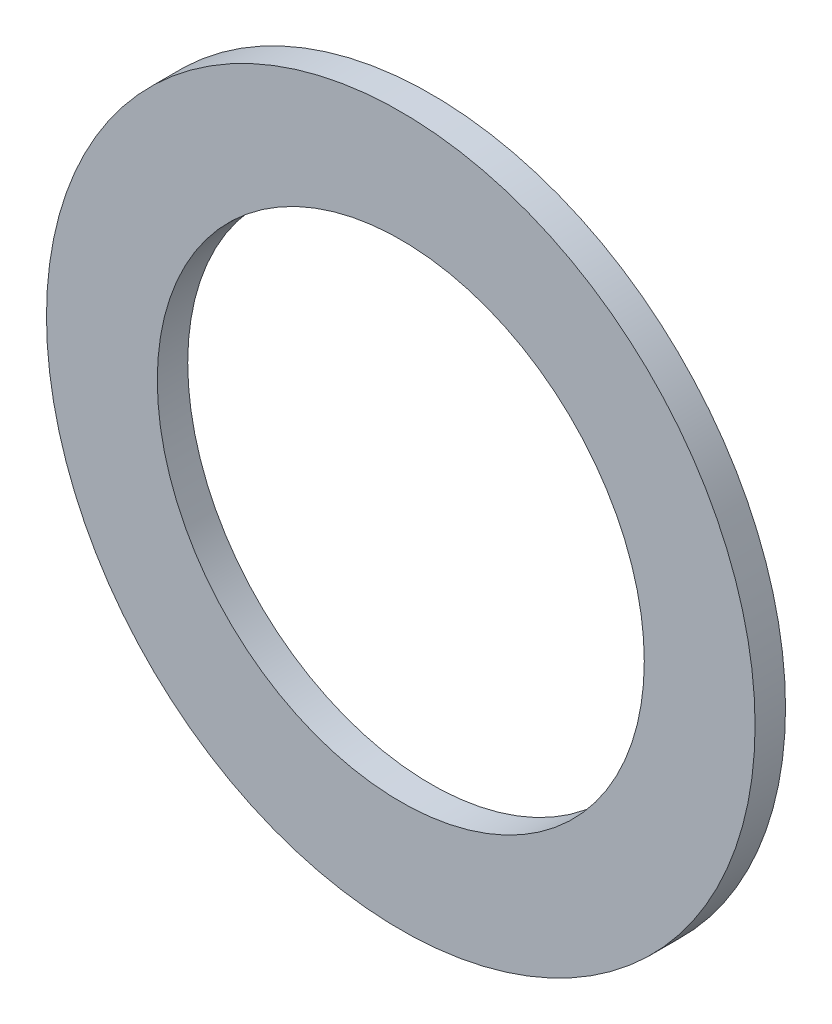
ISO-10303-21;
HEADER;
FILE_DESCRIPTION(('STEP AP214'),'2;1');
FILE_NAME('part.step','',(''),(''),'','','');
FILE_SCHEMA(('AUTOMOTIVE_DESIGN { 1 0 10303 214 1 1 1 1 }'));
ENDSEC;
DATA;
#1=APPLICATION_CONTEXT('core data for automotive mechanical design processes');
#2=APPLICATION_PROTOCOL_DEFINITION('international standard','automotive_design',2000,#1);
#3=PRODUCT_CONTEXT('',#1,'mechanical');
#4=PRODUCT('Part','Part','',(#3));
#5=PRODUCT_RELATED_PRODUCT_CATEGORY('part','',(#4));
#6=PRODUCT_DEFINITION_FORMATION('','',#4);
#7=PRODUCT_DEFINITION_CONTEXT('part definition',#1,'design');
#8=PRODUCT_DEFINITION('design','',#6,#7);
#9=PRODUCT_DEFINITION_SHAPE('','',#8);
#10=(LENGTH_UNIT() NAMED_UNIT(*) SI_UNIT(.MILLI.,.METRE.));
#11=(NAMED_UNIT(*) PLANE_ANGLE_UNIT() SI_UNIT($,.RADIAN.));
#12=(NAMED_UNIT(*) SI_UNIT($,.STERADIAN.) SOLID_ANGLE_UNIT());
#13=UNCERTAINTY_MEASURE_WITH_UNIT(LENGTH_MEASURE(1.E-05),#10,'distance_accuracy_value','');
#14=(GEOMETRIC_REPRESENTATION_CONTEXT(3) GLOBAL_UNCERTAINTY_ASSIGNED_CONTEXT((#13)) GLOBAL_UNIT_ASSIGNED_CONTEXT((#10,
#11,#12)) REPRESENTATION_CONTEXT('',''));
#15=CARTESIAN_POINT('',(0.,0.,0.));
#16=DIRECTION('',(0.,0.,1.));
#17=DIRECTION('',(1.,0.,0.));
#18=AXIS2_PLACEMENT_3D('',#15,#16,#17);
#19=CARTESIAN_POINT('',(0.,0.,6.35));
#20=DIRECTION('',(0.,0.,1.));
#21=DIRECTION('',(1.,0.,0.));
#22=AXIS2_PLACEMENT_3D('',#19,#20,#21);
#23=PLANE('',#22);
#24=CARTESIAN_POINT('',(0.,0.,6.35));
#25=DIRECTION('',(0.,0.,1.));
#26=DIRECTION('',(1.,0.,0.));
#27=AXIS2_PLACEMENT_3D('',#24,#25,#26);
#28=CIRCLE('',#27,73.914);
#29=CARTESIAN_POINT('',(73.914,0.,6.35));
#30=VERTEX_POINT('',#29);
#31=EDGE_CURVE('E10',#30,#30,#28,.T.);
#32=ORIENTED_EDGE('',*,*,#31,.T.);
#33=EDGE_LOOP('',(#32));
#34=FACE_BOUND('',#33,.T.);
#35=CARTESIAN_POINT('',(0.,0.,6.35));
#36=DIRECTION('',(0.,0.,1.));
#37=DIRECTION('',(1.,0.,0.));
#38=AXIS2_PLACEMENT_3D('',#35,#36,#37);
#39=CIRCLE('',#38,50.8);
#40=CARTESIAN_POINT('',(50.8,0.,6.35));
#41=VERTEX_POINT('',#40);
#42=EDGE_CURVE('E45',#41,#41,#39,.T.);
#43=ORIENTED_EDGE('',*,*,#42,.F.);
#44=EDGE_LOOP('',(#43));
#45=FACE_BOUND('',#44,.T.);
#46=ADVANCED_FACE('F34',(#34,#45),#23,.T.);
#47=CARTESIAN_POINT('',(0.,0.,0.));
#48=DIRECTION('',(0.,0.,1.));
#49=DIRECTION('',(1.,0.,0.));
#50=AXIS2_PLACEMENT_3D('',#47,#48,#49);
#51=PLANE('',#50);
#52=CARTESIAN_POINT('',(0.,0.,0.));
#53=DIRECTION('',(0.,0.,1.));
#54=DIRECTION('',(1.,0.,0.));
#55=AXIS2_PLACEMENT_3D('',#52,#53,#54);
#56=CIRCLE('',#55,73.914);
#57=CARTESIAN_POINT('',(73.914,0.,0.));
#58=VERTEX_POINT('',#57);
#59=EDGE_CURVE('E38',#58,#58,#56,.T.);
#60=ORIENTED_EDGE('',*,*,#59,.F.);
#61=EDGE_LOOP('',(#60));
#62=FACE_BOUND('',#61,.T.);
#63=CARTESIAN_POINT('',(0.,0.,0.));
#64=DIRECTION('',(0.,0.,1.));
#65=DIRECTION('',(1.,0.,0.));
#66=AXIS2_PLACEMENT_3D('',#63,#64,#65);
#67=CIRCLE('',#66,50.8);
#68=CARTESIAN_POINT('',(50.8,0.,0.));
#69=VERTEX_POINT('',#68);
#70=EDGE_CURVE('E47',#69,#69,#67,.T.);
#71=ORIENTED_EDGE('',*,*,#70,.T.);
#72=EDGE_LOOP('',(#71));
#73=FACE_BOUND('',#72,.T.);
#74=ADVANCED_FACE('F57',(#62,#73),#51,.F.);
#75=CARTESIAN_POINT('',(0.,0.,6.35));
#76=DIRECTION('',(0.,0.,-1.));
#77=DIRECTION('',(-1.,0.,0.));
#78=AXIS2_PLACEMENT_3D('',#75,#76,#77);
#79=CYLINDRICAL_SURFACE('',#78,73.914);
#80=ORIENTED_EDGE('',*,*,#31,.F.);
#81=EDGE_LOOP('',(#80));
#82=FACE_BOUND('',#81,.T.);
#83=ORIENTED_EDGE('',*,*,#59,.T.);
#84=EDGE_LOOP('',(#83));
#85=FACE_BOUND('',#84,.T.);
#86=ADVANCED_FACE('F36',(#82,#85),#79,.T.);
#87=CARTESIAN_POINT('',(0.,0.,6.35));
#88=DIRECTION('',(0.,0.,-1.));
#89=DIRECTION('',(-1.,0.,0.));
#90=AXIS2_PLACEMENT_3D('',#87,#88,#89);
#91=CYLINDRICAL_SURFACE('',#90,50.8);
#92=ORIENTED_EDGE('',*,*,#42,.T.);
#93=EDGE_LOOP('',(#92));
#94=FACE_BOUND('',#93,.T.);
#95=ORIENTED_EDGE('',*,*,#70,.F.);
#96=EDGE_LOOP('',(#95));
#97=FACE_BOUND('',#96,.T.);
#98=ADVANCED_FACE('F53',(#94,#97),#91,.F.);
#99=CLOSED_SHELL('',(#46,#74,#86,#98));
#100=MANIFOLD_SOLID_BREP('B2',#99);
#101=ADVANCED_BREP_SHAPE_REPRESENTATION('',(#18,#100),#14);
#102=SHAPE_DEFINITION_REPRESENTATION(#9,#101);
ENDSEC;
END-ISO-10303-21;
